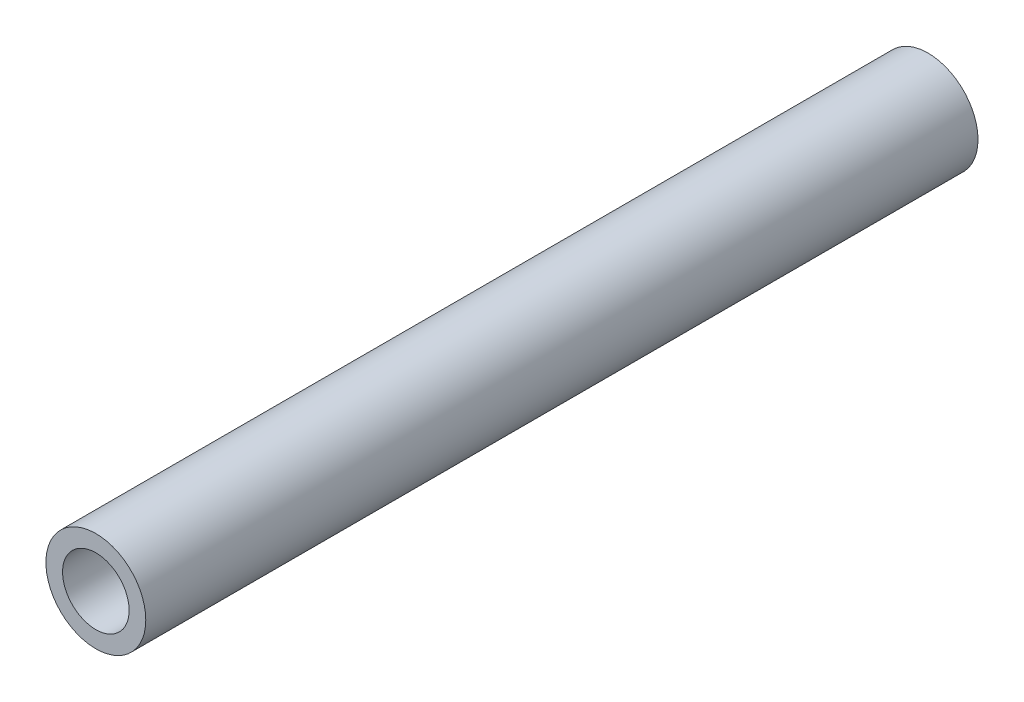
ISO-10303-21;
HEADER;
FILE_DESCRIPTION(('STEP AP214'),'2;1');
FILE_NAME('part.step','',(''),(''),'','','');
FILE_SCHEMA(('AUTOMOTIVE_DESIGN { 1 0 10303 214 1 1 1 1 }'));
ENDSEC;
DATA;
#1=APPLICATION_CONTEXT('core data for automotive mechanical design processes');
#2=APPLICATION_PROTOCOL_DEFINITION('international standard','automotive_design',2000,#1);
#3=PRODUCT_CONTEXT('',#1,'mechanical');
#4=PRODUCT('Part','Part','',(#3));
#5=PRODUCT_RELATED_PRODUCT_CATEGORY('part','',(#4));
#6=PRODUCT_DEFINITION_FORMATION('','',#4);
#7=PRODUCT_DEFINITION_CONTEXT('part definition',#1,'design');
#8=PRODUCT_DEFINITION('design','',#6,#7);
#9=PRODUCT_DEFINITION_SHAPE('','',#8);
#10=(LENGTH_UNIT() NAMED_UNIT(*) SI_UNIT(.MILLI.,.METRE.));
#11=(NAMED_UNIT(*) PLANE_ANGLE_UNIT() SI_UNIT($,.RADIAN.));
#12=(NAMED_UNIT(*) SI_UNIT($,.STERADIAN.) SOLID_ANGLE_UNIT());
#13=UNCERTAINTY_MEASURE_WITH_UNIT(LENGTH_MEASURE(1.E-05),#10,'distance_accuracy_value','');
#14=(GEOMETRIC_REPRESENTATION_CONTEXT(3) GLOBAL_UNCERTAINTY_ASSIGNED_CONTEXT((#13)) GLOBAL_UNIT_ASSIGNED_CONTEXT((#10,
#11,#12)) REPRESENTATION_CONTEXT('',''));
#15=CARTESIAN_POINT('',(0.,0.,0.));
#16=DIRECTION('',(0.,0.,1.));
#17=DIRECTION('',(1.,0.,0.));
#18=AXIS2_PLACEMENT_3D('',#15,#16,#17);
#19=CARTESIAN_POINT('',(0.,0.,25.));
#20=DIRECTION('',(0.,0.,1.));
#21=DIRECTION('',(1.,0.,0.));
#22=AXIS2_PLACEMENT_3D('',#19,#20,#21);
#23=PLANE('',#22);
#24=CARTESIAN_POINT('',(0.,0.,25.));
#25=DIRECTION('',(0.,0.,1.));
#26=DIRECTION('',(1.,0.,0.));
#27=AXIS2_PLACEMENT_3D('',#24,#25,#26);
#28=CIRCLE('',#27,3.);
#29=CARTESIAN_POINT('',(3.,0.,25.));
#30=VERTEX_POINT('',#29);
#31=EDGE_CURVE('E12',#30,#30,#28,.T.);
#32=ORIENTED_EDGE('',*,*,#31,.T.);
#33=EDGE_LOOP('',(#32));
#34=FACE_BOUND('',#33,.T.);
#35=CARTESIAN_POINT('',(0.,0.,25.));
#36=DIRECTION('',(0.,0.,1.));
#37=DIRECTION('',(1.,0.,0.));
#38=AXIS2_PLACEMENT_3D('',#35,#36,#37);
#39=CIRCLE('',#38,2.);
#40=CARTESIAN_POINT('',(2.,0.,25.));
#41=VERTEX_POINT('',#40);
#42=EDGE_CURVE('E56',#41,#41,#39,.T.);
#43=ORIENTED_EDGE('',*,*,#42,.F.);
#44=EDGE_LOOP('',(#43));
#45=FACE_BOUND('',#44,.T.);
#46=ADVANCED_FACE('F45',(#34,#45),#23,.T.);
#47=CARTESIAN_POINT('',(0.,0.,-25.));
#48=DIRECTION('',(0.,0.,1.));
#49=DIRECTION('',(1.,0.,0.));
#50=AXIS2_PLACEMENT_3D('',#47,#48,#49);
#51=PLANE('',#50);
#52=CARTESIAN_POINT('',(0.,0.,-25.));
#53=DIRECTION('',(0.,0.,1.));
#54=DIRECTION('',(1.,0.,0.));
#55=AXIS2_PLACEMENT_3D('',#52,#53,#54);
#56=CIRCLE('',#55,3.);
#57=CARTESIAN_POINT('',(3.,0.,-25.));
#58=VERTEX_POINT('',#57);
#59=EDGE_CURVE('E49',#58,#58,#56,.T.);
#60=ORIENTED_EDGE('',*,*,#59,.F.);
#61=EDGE_LOOP('',(#60));
#62=FACE_BOUND('',#61,.T.);
#63=CARTESIAN_POINT('',(0.,0.,-25.));
#64=DIRECTION('',(0.,0.,1.));
#65=DIRECTION('',(1.,0.,0.));
#66=AXIS2_PLACEMENT_3D('',#63,#64,#65);
#67=CIRCLE('',#66,2.);
#68=CARTESIAN_POINT('',(2.,0.,-25.));
#69=VERTEX_POINT('',#68);
#70=EDGE_CURVE('E58',#69,#69,#67,.T.);
#71=ORIENTED_EDGE('',*,*,#70,.T.);
#72=EDGE_LOOP('',(#71));
#73=FACE_BOUND('',#72,.T.);
#74=ADVANCED_FACE('F68',(#62,#73),#51,.F.);
#75=CARTESIAN_POINT('',(0.,0.,25.));
#76=DIRECTION('',(0.,0.,-1.));
#77=DIRECTION('',(-1.,0.,0.));
#78=AXIS2_PLACEMENT_3D('',#75,#76,#77);
#79=CYLINDRICAL_SURFACE('',#78,3.);
#80=ORIENTED_EDGE('',*,*,#31,.F.);
#81=EDGE_LOOP('',(#80));
#82=FACE_BOUND('',#81,.T.);
#83=ORIENTED_EDGE('',*,*,#59,.T.);
#84=EDGE_LOOP('',(#83));
#85=FACE_BOUND('',#84,.T.);
#86=ADVANCED_FACE('F47',(#82,#85),#79,.T.);
#87=CARTESIAN_POINT('',(0.,0.,25.));
#88=DIRECTION('',(0.,0.,-1.));
#89=DIRECTION('',(-1.,0.,0.));
#90=AXIS2_PLACEMENT_3D('',#87,#88,#89);
#91=CYLINDRICAL_SURFACE('',#90,2.);
#92=ORIENTED_EDGE('',*,*,#42,.T.);
#93=EDGE_LOOP('',(#92));
#94=FACE_BOUND('',#93,.T.);
#95=ORIENTED_EDGE('',*,*,#70,.F.);
#96=EDGE_LOOP('',(#95));
#97=FACE_BOUND('',#96,.T.);
#98=ADVANCED_FACE('F64',(#94,#97),#91,.F.);
#99=CLOSED_SHELL('',(#46,#74,#86,#98));
#100=MANIFOLD_SOLID_BREP('B2',#99);
#101=ADVANCED_BREP_SHAPE_REPRESENTATION('',(#18,#100),#14);
#102=SHAPE_DEFINITION_REPRESENTATION(#9,#101);
ENDSEC;
END-ISO-10303-21;
